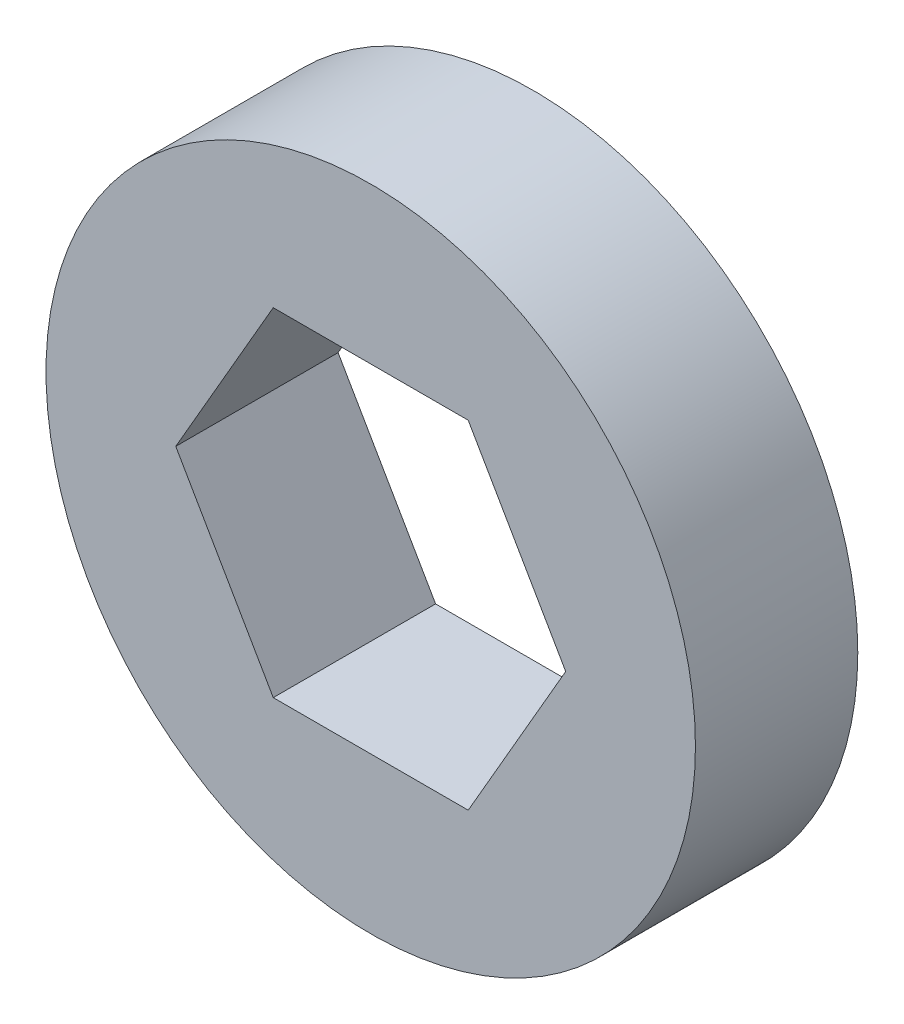
ISO-10303-21;
HEADER;
FILE_DESCRIPTION(('STEP AP214'),'2;1');
FILE_NAME('part.step','',(''),(''),'','','');
FILE_SCHEMA(('AUTOMOTIVE_DESIGN { 1 0 10303 214 1 1 1 1 }'));
ENDSEC;
DATA;
#1=APPLICATION_CONTEXT('core data for automotive mechanical design processes');
#2=APPLICATION_PROTOCOL_DEFINITION('international standard','automotive_design',2000,#1);
#3=PRODUCT_CONTEXT('',#1,'mechanical');
#4=PRODUCT('Part','Part','',(#3));
#5=PRODUCT_RELATED_PRODUCT_CATEGORY('part','',(#4));
#6=PRODUCT_DEFINITION_FORMATION('','',#4);
#7=PRODUCT_DEFINITION_CONTEXT('part definition',#1,'design');
#8=PRODUCT_DEFINITION('design','',#6,#7);
#9=PRODUCT_DEFINITION_SHAPE('','',#8);
#10=(LENGTH_UNIT() NAMED_UNIT(*) SI_UNIT(.MILLI.,.METRE.));
#11=(NAMED_UNIT(*) PLANE_ANGLE_UNIT() SI_UNIT($,.RADIAN.));
#12=(NAMED_UNIT(*) SI_UNIT($,.STERADIAN.) SOLID_ANGLE_UNIT());
#13=UNCERTAINTY_MEASURE_WITH_UNIT(LENGTH_MEASURE(1.E-05),#10,'distance_accuracy_value','');
#14=(GEOMETRIC_REPRESENTATION_CONTEXT(3) GLOBAL_UNCERTAINTY_ASSIGNED_CONTEXT((#13)) GLOBAL_UNIT_ASSIGNED_CONTEXT((#10,
#11,#12)) REPRESENTATION_CONTEXT('',''));
#15=CARTESIAN_POINT('',(0.,0.,0.));
#16=DIRECTION('',(0.,0.,1.));
#17=DIRECTION('',(1.,0.,0.));
#18=AXIS2_PLACEMENT_3D('',#15,#16,#17);
#19=CARTESIAN_POINT('',(0.,0.,6.35));
#20=DIRECTION('',(0.,0.,1.));
#21=DIRECTION('',(1.,0.,0.));
#22=AXIS2_PLACEMENT_3D('',#19,#20,#21);
#23=PLANE('',#22);
#24=CARTESIAN_POINT('',(0.,0.,6.35));
#25=DIRECTION('',(0.,0.,1.));
#26=DIRECTION('',(1.,0.,0.));
#27=AXIS2_PLACEMENT_3D('',#24,#25,#26);
#28=CIRCLE('',#27,12.7);
#29=CARTESIAN_POINT('',(12.7,0.,6.35));
#30=VERTEX_POINT('',#29);
#31=EDGE_CURVE('E11',#30,#30,#28,.T.);
#32=ORIENTED_EDGE('',*,*,#31,.T.);
#33=EDGE_LOOP('',(#32));
#34=FACE_BOUND('',#33,.T.);
#35=DIRECTION('',(0.5,0.866025403784438,0.));
#36=VECTOR('',#35,1.);
#37=CARTESIAN_POINT('',(3.81282117772829,-6.604,6.35));
#38=LINE('',#37,#36);
#39=CARTESIAN_POINT('',(3.81282117772829,-6.604,6.35));
#40=VERTEX_POINT('',#39);
#41=CARTESIAN_POINT('',(7.62564235545658,0.,6.35));
#42=VERTEX_POINT('',#41);
#43=EDGE_CURVE('E98',#40,#42,#38,.T.);
#44=ORIENTED_EDGE('',*,*,#43,.F.);
#45=DIRECTION('',(1.,0.,0.));
#46=VECTOR('',#45,1.);
#47=CARTESIAN_POINT('',(-3.81282117772829,-6.604,6.35));
#48=LINE('',#47,#46);
#49=CARTESIAN_POINT('',(-3.81282117772829,-6.604,6.35));
#50=VERTEX_POINT('',#49);
#51=EDGE_CURVE('E90',#50,#40,#48,.T.);
#52=ORIENTED_EDGE('',*,*,#51,.F.);
#53=DIRECTION('',(0.5,-0.866025403784439,0.));
#54=VECTOR('',#53,1.);
#55=CARTESIAN_POINT('',(-7.62564235545658,0.,6.35));
#56=LINE('',#55,#54);
#57=CARTESIAN_POINT('',(-7.62564235545658,0.,6.35));
#58=VERTEX_POINT('',#57);
#59=EDGE_CURVE('E118',#58,#50,#56,.T.);
#60=ORIENTED_EDGE('',*,*,#59,.F.);
#61=DIRECTION('',(-0.5,-0.866025403784438,0.));
#62=VECTOR('',#61,1.);
#63=CARTESIAN_POINT('',(-3.81282117772829,6.604,6.35));
#64=LINE('',#63,#62);
#65=CARTESIAN_POINT('',(-3.81282117772829,6.604,6.35));
#66=VERTEX_POINT('',#65);
#67=EDGE_CURVE('E116',#66,#58,#64,.T.);
#68=ORIENTED_EDGE('',*,*,#67,.F.);
#69=DIRECTION('',(-1.,0.,0.));
#70=VECTOR('',#69,1.);
#71=CARTESIAN_POINT('',(3.81282117772829,6.604,6.35));
#72=LINE('',#71,#70);
#73=CARTESIAN_POINT('',(3.81282117772829,6.604,6.35));
#74=VERTEX_POINT('',#73);
#75=EDGE_CURVE('E112',#74,#66,#72,.T.);
#76=ORIENTED_EDGE('',*,*,#75,.F.);
#77=DIRECTION('',(-0.5,0.866025403784439,0.));
#78=VECTOR('',#77,1.);
#79=CARTESIAN_POINT('',(7.62564235545658,0.,6.35));
#80=LINE('',#79,#78);
#81=EDGE_CURVE('E110',#42,#74,#80,.T.);
#82=ORIENTED_EDGE('',*,*,#81,.F.);
#83=EDGE_LOOP('',(#44,#52,#60,#68,#76,#82));
#84=FACE_BOUND('',#83,.T.);
#85=ADVANCED_FACE('F37',(#34,#84),#23,.T.);
#86=CARTESIAN_POINT('',(0.,0.,0.));
#87=DIRECTION('',(0.,0.,1.));
#88=DIRECTION('',(1.,0.,0.));
#89=AXIS2_PLACEMENT_3D('',#86,#87,#88);
#90=PLANE('',#89);
#91=CARTESIAN_POINT('',(0.,0.,0.));
#92=DIRECTION('',(0.,0.,1.));
#93=DIRECTION('',(1.,0.,0.));
#94=AXIS2_PLACEMENT_3D('',#91,#92,#93);
#95=CIRCLE('',#94,12.7);
#96=CARTESIAN_POINT('',(12.7,0.,0.));
#97=VERTEX_POINT('',#96);
#98=EDGE_CURVE('E41',#97,#97,#95,.T.);
#99=ORIENTED_EDGE('',*,*,#98,.F.);
#100=EDGE_LOOP('',(#99));
#101=FACE_BOUND('',#100,.T.);
#102=DIRECTION('',(1.,0.,0.));
#103=VECTOR('',#102,1.);
#104=CARTESIAN_POINT('',(-3.81282117772829,-6.604,0.));
#105=LINE('',#104,#103);
#106=CARTESIAN_POINT('',(-3.81282117772829,-6.604,0.));
#107=VERTEX_POINT('',#106);
#108=CARTESIAN_POINT('',(3.81282117772829,-6.604,0.));
#109=VERTEX_POINT('',#108);
#110=EDGE_CURVE('E60',#107,#109,#105,.T.);
#111=ORIENTED_EDGE('',*,*,#110,.T.);
#112=DIRECTION('',(0.5,0.866025403784438,0.));
#113=VECTOR('',#112,1.);
#114=CARTESIAN_POINT('',(3.81282117772829,-6.604,0.));
#115=LINE('',#114,#113);
#116=CARTESIAN_POINT('',(7.62564235545658,0.,0.));
#117=VERTEX_POINT('',#116);
#118=EDGE_CURVE('E105',#109,#117,#115,.T.);
#119=ORIENTED_EDGE('',*,*,#118,.T.);
#120=DIRECTION('',(-0.5,0.866025403784439,0.));
#121=VECTOR('',#120,1.);
#122=CARTESIAN_POINT('',(7.62564235545658,0.,0.));
#123=LINE('',#122,#121);
#124=CARTESIAN_POINT('',(3.81282117772829,6.604,0.));
#125=VERTEX_POINT('',#124);
#126=EDGE_CURVE('E122',#117,#125,#123,.T.);
#127=ORIENTED_EDGE('',*,*,#126,.T.);
#128=DIRECTION('',(-1.,0.,0.));
#129=VECTOR('',#128,1.);
#130=CARTESIAN_POINT('',(3.81282117772829,6.604,0.));
#131=LINE('',#130,#129);
#132=CARTESIAN_POINT('',(-3.81282117772829,6.604,0.));
#133=VERTEX_POINT('',#132);
#134=EDGE_CURVE('E125',#125,#133,#131,.T.);
#135=ORIENTED_EDGE('',*,*,#134,.T.);
#136=DIRECTION('',(-0.5,-0.866025403784438,0.));
#137=VECTOR('',#136,1.);
#138=CARTESIAN_POINT('',(-3.81282117772829,6.604,0.));
#139=LINE('',#138,#137);
#140=CARTESIAN_POINT('',(-7.62564235545658,0.,0.));
#141=VERTEX_POINT('',#140);
#142=EDGE_CURVE('E128',#133,#141,#139,.T.);
#143=ORIENTED_EDGE('',*,*,#142,.T.);
#144=DIRECTION('',(0.5,-0.866025403784439,0.));
#145=VECTOR('',#144,1.);
#146=CARTESIAN_POINT('',(-7.62564235545658,0.,0.));
#147=LINE('',#146,#145);
#148=EDGE_CURVE('E99',#141,#107,#147,.T.);
#149=ORIENTED_EDGE('',*,*,#148,.T.);
#150=EDGE_LOOP('',(#111,#119,#127,#135,#143,#149));
#151=FACE_BOUND('',#150,.T.);
#152=ADVANCED_FACE('F145',(#101,#151),#90,.F.);
#153=CARTESIAN_POINT('',(0.,0.,6.35));
#154=DIRECTION('',(0.,0.,-1.));
#155=DIRECTION('',(-1.,0.,0.));
#156=AXIS2_PLACEMENT_3D('',#153,#154,#155);
#157=CYLINDRICAL_SURFACE('',#156,12.7);
#158=ORIENTED_EDGE('',*,*,#31,.F.);
#159=EDGE_LOOP('',(#158));
#160=FACE_BOUND('',#159,.T.);
#161=ORIENTED_EDGE('',*,*,#98,.T.);
#162=EDGE_LOOP('',(#161));
#163=FACE_BOUND('',#162,.T.);
#164=ADVANCED_FACE('F39',(#160,#163),#157,.T.);
#165=CARTESIAN_POINT('',(-3.81282117772829,-6.604,6.35));
#166=DIRECTION('',(0.,1.,0.));
#167=DIRECTION('',(0.,0.,1.));
#168=AXIS2_PLACEMENT_3D('',#165,#166,#167);
#169=PLANE('',#168);
#170=ORIENTED_EDGE('',*,*,#110,.F.);
#171=DIRECTION('',(0.,0.,-1.));
#172=VECTOR('',#171,1.);
#173=CARTESIAN_POINT('',(-3.81282117772829,-6.604,6.35));
#174=LINE('',#173,#172);
#175=EDGE_CURVE('E94',#50,#107,#174,.T.);
#176=ORIENTED_EDGE('',*,*,#175,.F.);
#177=ORIENTED_EDGE('',*,*,#51,.T.);
#178=DIRECTION('',(0.,0.,-1.));
#179=VECTOR('',#178,1.);
#180=CARTESIAN_POINT('',(3.81282117772829,-6.604,6.35));
#181=LINE('',#180,#179);
#182=EDGE_CURVE('E93',#40,#109,#181,.T.);
#183=ORIENTED_EDGE('',*,*,#182,.T.);
#184=EDGE_LOOP('',(#170,#176,#177,#183));
#185=FACE_BOUND('',#184,.T.);
#186=ADVANCED_FACE('F92',(#185),#169,.T.);
#187=CARTESIAN_POINT('',(3.81282117772829,-6.604,6.35));
#188=DIRECTION('',(-0.866025403784438,0.5,0.));
#189=DIRECTION('',(-0.5,-0.866025403784439,0.));
#190=AXIS2_PLACEMENT_3D('',#187,#188,#189);
#191=PLANE('',#190);
#192=ORIENTED_EDGE('',*,*,#118,.F.);
#193=ORIENTED_EDGE('',*,*,#182,.F.);
#194=ORIENTED_EDGE('',*,*,#43,.T.);
#195=DIRECTION('',(0.,0.,-1.));
#196=VECTOR('',#195,1.);
#197=CARTESIAN_POINT('',(7.62564235545658,0.,6.35));
#198=LINE('',#197,#196);
#199=EDGE_CURVE('E106',#42,#117,#198,.T.);
#200=ORIENTED_EDGE('',*,*,#199,.T.);
#201=EDGE_LOOP('',(#192,#193,#194,#200));
#202=FACE_BOUND('',#201,.T.);
#203=ADVANCED_FACE('F102',(#202),#191,.T.);
#204=CARTESIAN_POINT('',(7.62564235545658,0.,6.35));
#205=DIRECTION('',(-0.866025403784439,-0.5,0.));
#206=DIRECTION('',(0.5,-0.866025403784439,0.));
#207=AXIS2_PLACEMENT_3D('',#204,#205,#206);
#208=PLANE('',#207);
#209=ORIENTED_EDGE('',*,*,#126,.F.);
#210=ORIENTED_EDGE('',*,*,#199,.F.);
#211=ORIENTED_EDGE('',*,*,#81,.T.);
#212=DIRECTION('',(0.,0.,-1.));
#213=VECTOR('',#212,1.);
#214=CARTESIAN_POINT('',(3.81282117772829,6.604,6.35));
#215=LINE('',#214,#213);
#216=EDGE_CURVE('E137',#74,#125,#215,.T.);
#217=ORIENTED_EDGE('',*,*,#216,.T.);
#218=EDGE_LOOP('',(#209,#210,#211,#217));
#219=FACE_BOUND('',#218,.T.);
#220=ADVANCED_FACE('F141',(#219),#208,.T.);
#221=CARTESIAN_POINT('',(3.81282117772829,6.604,6.35));
#222=DIRECTION('',(0.,-1.,0.));
#223=DIRECTION('',(1.,0.,0.));
#224=AXIS2_PLACEMENT_3D('',#221,#222,#223);
#225=PLANE('',#224);
#226=ORIENTED_EDGE('',*,*,#134,.F.);
#227=ORIENTED_EDGE('',*,*,#216,.F.);
#228=ORIENTED_EDGE('',*,*,#75,.T.);
#229=DIRECTION('',(0.,0.,-1.));
#230=VECTOR('',#229,1.);
#231=CARTESIAN_POINT('',(-3.81282117772829,6.604,6.35));
#232=LINE('',#231,#230);
#233=EDGE_CURVE('E135',#66,#133,#232,.T.);
#234=ORIENTED_EDGE('',*,*,#233,.T.);
#235=EDGE_LOOP('',(#226,#227,#228,#234));
#236=FACE_BOUND('',#235,.T.);
#237=ADVANCED_FACE('F153',(#236),#225,.T.);
#238=CARTESIAN_POINT('',(-3.81282117772829,6.604,6.35));
#239=DIRECTION('',(0.866025403784438,-0.5,0.));
#240=DIRECTION('',(0.5,0.866025403784439,0.));
#241=AXIS2_PLACEMENT_3D('',#238,#239,#240);
#242=PLANE('',#241);
#243=ORIENTED_EDGE('',*,*,#142,.F.);
#244=ORIENTED_EDGE('',*,*,#233,.F.);
#245=ORIENTED_EDGE('',*,*,#67,.T.);
#246=DIRECTION('',(0.,0.,-1.));
#247=VECTOR('',#246,1.);
#248=CARTESIAN_POINT('',(-7.62564235545658,0.,6.35));
#249=LINE('',#248,#247);
#250=EDGE_CURVE('E52',#58,#141,#249,.T.);
#251=ORIENTED_EDGE('',*,*,#250,.T.);
#252=EDGE_LOOP('',(#243,#244,#245,#251));
#253=FACE_BOUND('',#252,.T.);
#254=ADVANCED_FACE('F151',(#253),#242,.T.);
#255=CARTESIAN_POINT('',(-7.62564235545658,0.,6.35));
#256=DIRECTION('',(0.866025403784439,0.5,0.));
#257=DIRECTION('',(-0.5,0.866025403784439,0.));
#258=AXIS2_PLACEMENT_3D('',#255,#256,#257);
#259=PLANE('',#258);
#260=ORIENTED_EDGE('',*,*,#148,.F.);
#261=ORIENTED_EDGE('',*,*,#250,.F.);
#262=ORIENTED_EDGE('',*,*,#59,.T.);
#263=ORIENTED_EDGE('',*,*,#175,.T.);
#264=EDGE_LOOP('',(#260,#261,#262,#263));
#265=FACE_BOUND('',#264,.T.);
#266=ADVANCED_FACE('F147',(#265),#259,.T.);
#267=CLOSED_SHELL('',(#85,#152,#164,#186,#203,#220,#237,#254,#266));
#268=MANIFOLD_SOLID_BREP('B2',#267);
#269=ADVANCED_BREP_SHAPE_REPRESENTATION('',(#18,#268),#14);
#270=SHAPE_DEFINITION_REPRESENTATION(#9,#269);
ENDSEC;
END-ISO-10303-21;
